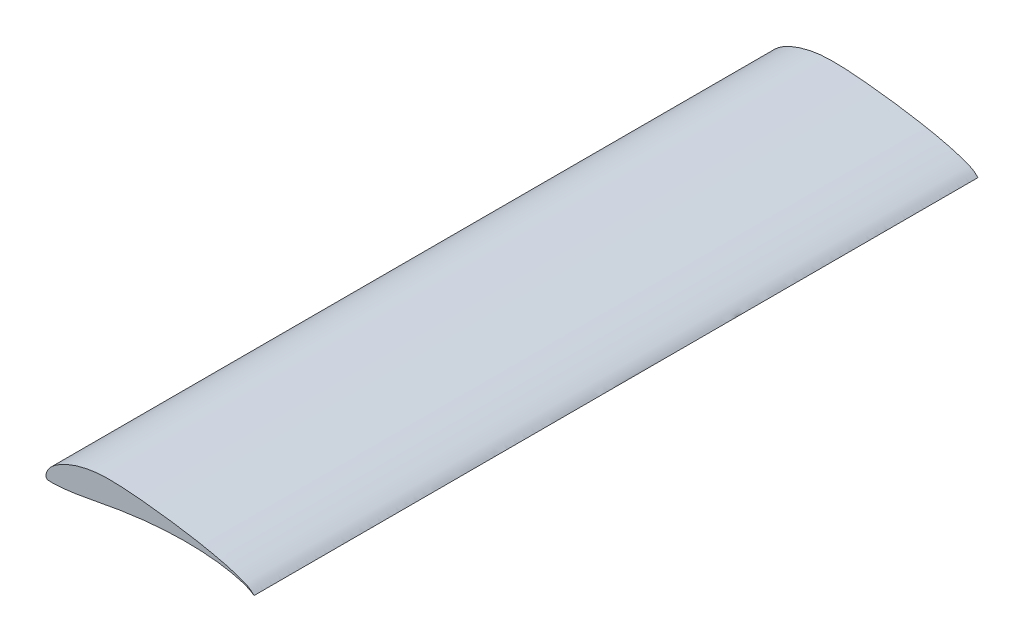
ISO-10303-21;
HEADER;
FILE_DESCRIPTION(('STEP AP214'),'2;1');
FILE_NAME('part.step','',(''),(''),'','','');
FILE_SCHEMA(('AUTOMOTIVE_DESIGN { 1 0 10303 214 1 1 1 1 }'));
ENDSEC;
DATA;
#1=APPLICATION_CONTEXT('core data for automotive mechanical design processes');
#2=APPLICATION_PROTOCOL_DEFINITION('international standard','automotive_design',2000,#1);
#3=PRODUCT_CONTEXT('',#1,'mechanical');
#4=PRODUCT('Part','Part','',(#3));
#5=PRODUCT_RELATED_PRODUCT_CATEGORY('part','',(#4));
#6=PRODUCT_DEFINITION_FORMATION('','',#4);
#7=PRODUCT_DEFINITION_CONTEXT('part definition',#1,'design');
#8=PRODUCT_DEFINITION('design','',#6,#7);
#9=PRODUCT_DEFINITION_SHAPE('','',#8);
#10=(LENGTH_UNIT() NAMED_UNIT(*) SI_UNIT(.MILLI.,.METRE.));
#11=(NAMED_UNIT(*) PLANE_ANGLE_UNIT() SI_UNIT($,.RADIAN.));
#12=(NAMED_UNIT(*) SI_UNIT($,.STERADIAN.) SOLID_ANGLE_UNIT());
#13=UNCERTAINTY_MEASURE_WITH_UNIT(LENGTH_MEASURE(1.E-05),#10,'distance_accuracy_value','');
#14=(GEOMETRIC_REPRESENTATION_CONTEXT(3) GLOBAL_UNCERTAINTY_ASSIGNED_CONTEXT((#13)) GLOBAL_UNIT_ASSIGNED_CONTEXT((#10,
#11,#12)) REPRESENTATION_CONTEXT('',''));
#15=CARTESIAN_POINT('',(0.,0.,0.));
#16=DIRECTION('',(0.,0.,1.));
#17=DIRECTION('',(1.,0.,0.));
#18=AXIS2_PLACEMENT_3D('',#15,#16,#17);
#19=CARTESIAN_POINT('',(292.1,0.,-508.));
#20=CARTESIAN_POINT('',(292.10174868937,0.00743604675368815,-508.));
#21=CARTESIAN_POINT('',(291.141508660816,0.722880275148406,-508.));
#22=CARTESIAN_POINT('',(290.329412119825,1.51968766740587,-508.));
#23=CARTESIAN_POINT('',(288.526229752874,3.1839768216267,-508.));
#24=CARTESIAN_POINT('',(286.398896153237,4.95446224072514,-508.));
#25=CARTESIAN_POINT('',(283.488886511464,6.73930853472732,-508.));
#26=CARTESIAN_POINT('',(279.870267403727,8.46902637101378,-508.));
#27=CARTESIAN_POINT('',(275.501742517788,10.2741964429917,-508.));
#28=CARTESIAN_POINT('',(270.389970767966,12.1296834292676,-508.));
#29=CARTESIAN_POINT('',(264.558800095709,14.0223796918718,-508.));
#30=CARTESIAN_POINT('',(258.038502142609,15.9358521159861,-508.));
#31=CARTESIAN_POINT('',(250.865588759589,17.8611197811556,-508.));
#32=CARTESIAN_POINT('',(243.079665674688,19.7805050529815,-508.));
#33=CARTESIAN_POINT('',(234.725371616939,21.6801135934577,-508.));
#34=CARTESIAN_POINT('',(225.852500238387,23.5480804603595,-508.));
#35=CARTESIAN_POINT('',(216.515233407206,25.3748028765026,-508.));
#36=CARTESIAN_POINT('',(206.768143255614,27.1378019443082,-508.));
#37=CARTESIAN_POINT('',(196.672609042899,28.8345588430789,-508.));
#38=CARTESIAN_POINT('',(186.286812137133,30.4432245657055,-508.));
#39=CARTESIAN_POINT('',(175.677917755839,31.9669403467707,-508.));
#40=CARTESIAN_POINT('',(164.913916248448,33.3936314987688,-508.));
#41=CARTESIAN_POINT('',(154.072771327712,34.7187326881358,-508.));
#42=CARTESIAN_POINT('',(143.241149724161,35.951626349718,-508.));
#43=CARTESIAN_POINT('',(132.508721132156,37.0612033919483,-508.));
#44=CARTESIAN_POINT('',(121.962921004099,38.0266968191774,-508.));
#45=CARTESIAN_POINT('',(111.677919879016,38.7937633881828,-508.));
#46=CARTESIAN_POINT('',(101.712469459807,39.3214067384732,-508.));
#47=CARTESIAN_POINT('',(92.1220108045362,39.5492677217701,-508.));
#48=CARTESIAN_POINT('',(82.9556744692644,39.5250134087812,-508.));
#49=CARTESIAN_POINT('',(74.230559217162,39.0762027810472,-508.));
#50=CARTESIAN_POINT('',(65.9432851771043,38.1667082620123,-508.));
#51=CARTESIAN_POINT('',(58.0601167104942,36.8806695246744,-508.));
#52=CARTESIAN_POINT('',(50.5791512076867,35.2146176935372,-508.));
#53=CARTESIAN_POINT('',(43.5080742697038,33.2609395194381,-508.));
#54=CARTESIAN_POINT('',(36.8768044967487,31.0542376340717,-508.));
#55=CARTESIAN_POINT('',(30.7135440676395,28.6461158404434,-508.));
#56=CARTESIAN_POINT('',(25.0565922045393,26.0494759704529,-508.));
#57=CARTESIAN_POINT('',(19.9240904833014,23.3170372834694,-508.));
#58=CARTESIAN_POINT('',(15.3439613996676,20.4798728856683,-508.));
#59=CARTESIAN_POINT('',(11.3449274165843,17.5764288153793,-508.));
#60=CARTESIAN_POINT('',(7.9286385316132,14.6682470834465,-508.));
#61=CARTESIAN_POINT('',(5.14463693597222,11.7235827007778,-508.));
#62=CARTESIAN_POINT('',(3.00616860546707,8.7679365241755,-508.));
#63=CARTESIAN_POINT('',(1.42653590916057,5.89248641393546,-508.));
#64=CARTESIAN_POINT('',(0.414158520577073,3.16238276856456,-508.));
#65=CARTESIAN_POINT('',(-0.0682393541580431,0.642497929707103,-508.));
#66=CARTESIAN_POINT('',(0.0248764908269175,-1.48872736429846,-508.));
#67=CARTESIAN_POINT('',(0.573568752551456,-3.44340437544131,-508.));
#68=CARTESIAN_POINT('',(2.6131457490381,-4.41372036340078,-508.));
#69=CARTESIAN_POINT('',(5.35538380182884,-4.54985264061287,-508.));
#70=CARTESIAN_POINT('',(9.10675523423053,-4.68179257905758,-508.));
#71=CARTESIAN_POINT('',(13.8243695657241,-4.4783591430176,-508.));
#72=CARTESIAN_POINT('',(19.454908435426,-4.10451048328887,-508.));
#73=CARTESIAN_POINT('',(25.9357098231297,-3.50568599781193,-508.));
#74=CARTESIAN_POINT('',(33.2004571710568,-2.6954507219614,-508.));
#75=CARTESIAN_POINT('',(41.2137256622462,-1.65641846833688,-508.));
#76=CARTESIAN_POINT('',(49.9715993306038,-0.204216290787929,-508.));
#77=CARTESIAN_POINT('',(59.5167195116737,1.61682170012857,-508.));
#78=CARTESIAN_POINT('',(69.896805381292,3.59869214324346,-508.));
#79=CARTESIAN_POINT('',(81.0611199266692,5.69126319732166,-508.));
#80=CARTESIAN_POINT('',(92.9395395106316,7.8076789174098,-508.));
#81=CARTESIAN_POINT('',(105.444828594614,9.86851270360842,-508.));
#82=CARTESIAN_POINT('',(118.479970276983,11.804947922966,-508.));
#83=CARTESIAN_POINT('',(131.932628307681,13.5459491662827,-508.));
#84=CARTESIAN_POINT('',(145.681826700154,15.0408226784285,-508.));
#85=CARTESIAN_POINT('',(159.597686458834,16.2224586379187,-508.));
#86=CARTESIAN_POINT('',(173.540558501566,17.0600928311949,-508.));
#87=CARTESIAN_POINT('',(187.364775606378,17.5205867438787,-508.));
#88=CARTESIAN_POINT('',(200.92036927669,17.5787504245125,-508.));
#89=CARTESIAN_POINT('',(214.056105634627,17.2306319225389,-508.));
#90=CARTESIAN_POINT('',(226.621572717158,16.4843807599247,-508.));
#91=CARTESIAN_POINT('',(238.465672561794,15.3496255862295,-508.));
#92=CARTESIAN_POINT('',(249.447394068302,13.8699238511772,-508.));
#93=CARTESIAN_POINT('',(259.423758739276,12.0882109216768,-508.));
#94=CARTESIAN_POINT('',(268.277798116503,10.0641585717298,-508.));
#95=CARTESIAN_POINT('',(275.846336321307,7.8983323858687,-508.));
#96=CARTESIAN_POINT('',(282.040404303042,5.58677570384364,-508.));
#97=CARTESIAN_POINT('',(286.45971236369,3.47140540189966,-508.));
#98=CARTESIAN_POINT('',(289.717950220251,1.51546296693716,-508.));
#99=CARTESIAN_POINT('',(290.969625095689,0.758545510651311,-508.));
#100=CARTESIAN_POINT('',(292.098215759933,-0.00758722091191827,-508.));
#101=CARTESIAN_POINT('',(292.1,0.,-508.));
#102=B_SPLINE_CURVE_WITH_KNOTS('',3,(#19,#20,#21,#22,#23,#24,#25,#26,#27,#28,#29,#30,#31,#32,
#33,#34,#35,#36,#37,#38,#39,#40,#41,#42,#43,#44,#45,#46,#47,#48,#49,#50,#51,#52,#53,#54,#55,#56,
#57,#58,#59,#60,#61,#62,#63,#64,#65,#66,#67,#68,#69,#70,#71,#72,#73,#74,#75,#76,#77,#78,#79,#80,
#81,#82,#83,#84,#85,#86,#87,#88,#89,#90,#91,#92,#93,#94,#95,#96,#97,#98,#99,#100,#101),
.UNSPECIFIED.,.T.,.F.,(4,1,1,1,1,1,1,1,1,1,1,1,1,1,1,1,1,1,1,1,1,1,1,1,1,1,1,1,1,1,1,1,1,1,1,1,
1,1,1,1,1,1,1,1,1,1,1,1,1,1,1,1,1,1,1,1,1,1,1,1,1,1,1,1,1,1,1,1,1,1,1,1,1,1,1,1,1,1,1,1,4),(0.,
0.000979677557134093,0.00364886216776309,0.00748349851947811,0.0120952771855934,
0.0175255907768788,0.024051779993871,0.0317830505527586,0.0406778280832618,0.0507103007904779,
0.0618332290621795,0.0739892504845853,0.0871181731906812,0.101145048769791,0.115990637111827,
0.131570421640589,0.147788379302961,0.164550916882416,0.181757895150531,0.199311954944345,
0.217095071712264,0.234990228463986,0.252856883122009,0.270540593729572,0.287886779266045,
0.304773437599674,0.321101419214061,0.336806063174811,0.351800032584037,0.366031063392082,
0.379615674919835,0.392652962879186,0.405170358707495,0.417171919049936,0.428603516911185,
0.43941895910826,0.449596586064162,0.459102079103161,0.467907877534646,0.475988300736527,
0.483308968746149,0.489874507816402,0.495803249719207,0.501149411695553,0.50590307325604,
0.510046768536663,0.513579310681042,0.516446926626751,0.5193500525909,0.523823355179486,
0.529973793997694,0.537715654387927,0.546967844488146,0.55763736682571,0.569620481096633,
0.582804124215616,0.597246960791633,0.613135036654701,0.630443600329816,0.649056123608546,
0.668822256795696,0.689594964002684,0.711189650864602,0.733426688964389,0.756094117504156,
0.778988553684861,0.801889682684955,0.824566597829707,0.846792284880412,0.868338290507787,
0.888978162959066,0.908492011340558,0.926658767581933,0.943286193042322,0.958169210358794,
0.971135821634751,0.981955623079976,0.990251791025976,0.995852565249962,0.999000405686701,1.),.UNSPECIFIED.);
#103=DIRECTION('',(0.,0.,1.));
#104=VECTOR('',#103,1.);
#105=SURFACE_OF_LINEAR_EXTRUSION('',#102,#104);
#106=CARTESIAN_POINT('',(292.1,0.,-508.));
#107=VERTEX_POINT('',#106);
#108=EDGE_CURVE('E10',#107,#107,#102,.T.);
#109=ORIENTED_EDGE('',*,*,#108,.T.);
#110=EDGE_LOOP('',(#109));
#111=FACE_BOUND('',#110,.T.);
#112=CARTESIAN_POINT('',(292.1,0.,508.));
#113=CARTESIAN_POINT('',(292.10174868937,0.00743604675368815,508.));
#114=CARTESIAN_POINT('',(291.141508660816,0.722880275148406,508.));
#115=CARTESIAN_POINT('',(290.329412119825,1.51968766740587,508.));
#116=CARTESIAN_POINT('',(288.526229752874,3.1839768216267,508.));
#117=CARTESIAN_POINT('',(286.398896153237,4.95446224072514,508.));
#118=CARTESIAN_POINT('',(283.488886511464,6.73930853472732,508.));
#119=CARTESIAN_POINT('',(279.870267403727,8.46902637101378,508.));
#120=CARTESIAN_POINT('',(275.501742517788,10.2741964429917,508.));
#121=CARTESIAN_POINT('',(270.389970767966,12.1296834292676,508.));
#122=CARTESIAN_POINT('',(264.558800095709,14.0223796918718,508.));
#123=CARTESIAN_POINT('',(258.038502142609,15.9358521159861,508.));
#124=CARTESIAN_POINT('',(250.865588759589,17.8611197811556,508.));
#125=CARTESIAN_POINT('',(243.079665674688,19.7805050529815,508.));
#126=CARTESIAN_POINT('',(234.725371616939,21.6801135934577,508.));
#127=CARTESIAN_POINT('',(225.852500238387,23.5480804603595,508.));
#128=CARTESIAN_POINT('',(216.515233407206,25.3748028765026,508.));
#129=CARTESIAN_POINT('',(206.768143255614,27.1378019443082,508.));
#130=CARTESIAN_POINT('',(196.672609042899,28.8345588430789,508.));
#131=CARTESIAN_POINT('',(186.286812137133,30.4432245657055,508.));
#132=CARTESIAN_POINT('',(175.677917755839,31.9669403467707,508.));
#133=CARTESIAN_POINT('',(164.913916248448,33.3936314987688,508.));
#134=CARTESIAN_POINT('',(154.072771327712,34.7187326881358,508.));
#135=CARTESIAN_POINT('',(143.241149724161,35.951626349718,508.));
#136=CARTESIAN_POINT('',(132.508721132156,37.0612033919483,508.));
#137=CARTESIAN_POINT('',(121.962921004099,38.0266968191774,508.));
#138=CARTESIAN_POINT('',(111.677919879016,38.7937633881828,508.));
#139=CARTESIAN_POINT('',(101.712469459807,39.3214067384732,508.));
#140=CARTESIAN_POINT('',(92.1220108045362,39.5492677217701,508.));
#141=CARTESIAN_POINT('',(82.9556744692644,39.5250134087812,508.));
#142=CARTESIAN_POINT('',(74.230559217162,39.0762027810472,508.));
#143=CARTESIAN_POINT('',(65.9432851771043,38.1667082620123,508.));
#144=CARTESIAN_POINT('',(58.0601167104942,36.8806695246744,508.));
#145=CARTESIAN_POINT('',(50.5791512076867,35.2146176935372,508.));
#146=CARTESIAN_POINT('',(43.5080742697038,33.2609395194381,508.));
#147=CARTESIAN_POINT('',(36.8768044967487,31.0542376340717,508.));
#148=CARTESIAN_POINT('',(30.7135440676395,28.6461158404434,508.));
#149=CARTESIAN_POINT('',(25.0565922045393,26.0494759704529,508.));
#150=CARTESIAN_POINT('',(19.9240904833014,23.3170372834694,508.));
#151=CARTESIAN_POINT('',(15.3439613996676,20.4798728856683,508.));
#152=CARTESIAN_POINT('',(11.3449274165843,17.5764288153793,508.));
#153=CARTESIAN_POINT('',(7.9286385316132,14.6682470834465,508.));
#154=CARTESIAN_POINT('',(5.14463693597222,11.7235827007778,508.));
#155=CARTESIAN_POINT('',(3.00616860546707,8.7679365241755,508.));
#156=CARTESIAN_POINT('',(1.42653590916057,5.89248641393546,508.));
#157=CARTESIAN_POINT('',(0.414158520577073,3.16238276856456,508.));
#158=CARTESIAN_POINT('',(-0.0682393541580431,0.642497929707103,508.));
#159=CARTESIAN_POINT('',(0.0248764908269175,-1.48872736429846,508.));
#160=CARTESIAN_POINT('',(0.573568752551456,-3.44340437544131,508.));
#161=CARTESIAN_POINT('',(2.6131457490381,-4.41372036340078,508.));
#162=CARTESIAN_POINT('',(5.35538380182884,-4.54985264061287,508.));
#163=CARTESIAN_POINT('',(9.10675523423053,-4.68179257905758,508.));
#164=CARTESIAN_POINT('',(13.8243695657241,-4.4783591430176,508.));
#165=CARTESIAN_POINT('',(19.454908435426,-4.10451048328887,508.));
#166=CARTESIAN_POINT('',(25.9357098231297,-3.50568599781193,508.));
#167=CARTESIAN_POINT('',(33.2004571710568,-2.6954507219614,508.));
#168=CARTESIAN_POINT('',(41.2137256622462,-1.65641846833688,508.));
#169=CARTESIAN_POINT('',(49.9715993306038,-0.204216290787929,508.));
#170=CARTESIAN_POINT('',(59.5167195116737,1.61682170012857,508.));
#171=CARTESIAN_POINT('',(69.896805381292,3.59869214324346,508.));
#172=CARTESIAN_POINT('',(81.0611199266692,5.69126319732166,508.));
#173=CARTESIAN_POINT('',(92.9395395106316,7.8076789174098,508.));
#174=CARTESIAN_POINT('',(105.444828594614,9.86851270360842,508.));
#175=CARTESIAN_POINT('',(118.479970276983,11.804947922966,508.));
#176=CARTESIAN_POINT('',(131.932628307681,13.5459491662827,508.));
#177=CARTESIAN_POINT('',(145.681826700154,15.0408226784285,508.));
#178=CARTESIAN_POINT('',(159.597686458834,16.2224586379187,508.));
#179=CARTESIAN_POINT('',(173.540558501566,17.0600928311949,508.));
#180=CARTESIAN_POINT('',(187.364775606378,17.5205867438787,508.));
#181=CARTESIAN_POINT('',(200.92036927669,17.5787504245125,508.));
#182=CARTESIAN_POINT('',(214.056105634627,17.2306319225389,508.));
#183=CARTESIAN_POINT('',(226.621572717158,16.4843807599247,508.));
#184=CARTESIAN_POINT('',(238.465672561794,15.3496255862295,508.));
#185=CARTESIAN_POINT('',(249.447394068302,13.8699238511772,508.));
#186=CARTESIAN_POINT('',(259.423758739276,12.0882109216768,508.));
#187=CARTESIAN_POINT('',(268.277798116503,10.0641585717298,508.));
#188=CARTESIAN_POINT('',(275.846336321307,7.8983323858687,508.));
#189=CARTESIAN_POINT('',(282.040404303042,5.58677570384364,508.));
#190=CARTESIAN_POINT('',(286.45971236369,3.47140540189966,508.));
#191=CARTESIAN_POINT('',(289.717950220251,1.51546296693716,508.));
#192=CARTESIAN_POINT('',(290.969625095689,0.758545510651311,508.));
#193=CARTESIAN_POINT('',(292.098215759933,-0.00758722091191827,508.));
#194=CARTESIAN_POINT('',(292.1,0.,508.));
#195=B_SPLINE_CURVE_WITH_KNOTS('',3,(#112,#113,#114,#115,#116,#117,#118,#119,#120,#121,#122,
#123,#124,#125,#126,#127,#128,#129,#130,#131,#132,#133,#134,#135,#136,#137,#138,#139,#140,#141,
#142,#143,#144,#145,#146,#147,#148,#149,#150,#151,#152,#153,#154,#155,#156,#157,#158,#159,#160,
#161,#162,#163,#164,#165,#166,#167,#168,#169,#170,#171,#172,#173,#174,#175,#176,#177,#178,#179,
#180,#181,#182,#183,#184,#185,#186,#187,#188,#189,#190,#191,#192,#193,#194),.UNSPECIFIED.,.T.,
.F.,(4,1,1,1,1,1,1,1,1,1,1,1,1,1,1,1,1,1,1,1,1,1,1,1,1,1,1,1,1,1,1,1,1,1,1,1,1,1,1,1,1,1,1,1,1,
1,1,1,1,1,1,1,1,1,1,1,1,1,1,1,1,1,1,1,1,1,1,1,1,1,1,1,1,1,1,1,1,1,1,1,4),(0.,
0.000979677557134093,0.00364886216776309,0.00748349851947811,0.0120952771855934,
0.0175255907768788,0.024051779993871,0.0317830505527586,0.0406778280832618,0.0507103007904779,
0.0618332290621795,0.0739892504845853,0.0871181731906812,0.101145048769791,0.115990637111827,
0.131570421640589,0.147788379302961,0.164550916882416,0.181757895150531,0.199311954944345,
0.217095071712264,0.234990228463986,0.252856883122009,0.270540593729572,0.287886779266045,
0.304773437599674,0.321101419214061,0.336806063174811,0.351800032584037,0.366031063392082,
0.379615674919835,0.392652962879186,0.405170358707495,0.417171919049936,0.428603516911185,
0.43941895910826,0.449596586064162,0.459102079103161,0.467907877534646,0.475988300736527,
0.483308968746149,0.489874507816402,0.495803249719207,0.501149411695553,0.50590307325604,
0.510046768536663,0.513579310681042,0.516446926626751,0.5193500525909,0.523823355179486,
0.529973793997694,0.537715654387927,0.546967844488146,0.55763736682571,0.569620481096633,
0.582804124215616,0.597246960791633,0.613135036654701,0.630443600329816,0.649056123608546,
0.668822256795696,0.689594964002684,0.711189650864602,0.733426688964389,0.756094117504156,
0.778988553684861,0.801889682684955,0.824566597829707,0.846792284880412,0.868338290507787,
0.888978162959066,0.908492011340558,0.926658767581933,0.943286193042322,0.958169210358794,
0.971135821634751,0.981955623079976,0.990251791025976,0.995852565249962,0.999000405686701,1.),.UNSPECIFIED.);
#196=CARTESIAN_POINT('',(292.1,0.,508.));
#197=VERTEX_POINT('',#196);
#198=EDGE_CURVE('E51',#197,#197,#195,.T.);
#199=ORIENTED_EDGE('',*,*,#198,.F.);
#200=EDGE_LOOP('',(#199));
#201=FACE_BOUND('',#200,.T.);
#202=ADVANCED_FACE('F41',(#111,#201),#105,.T.);
#203=CARTESIAN_POINT('',(1.74611986948222,6.38763831285736,-508.));
#204=DIRECTION('',(0.,0.,-1.));
#205=DIRECTION('',(-1.,0.,0.));
#206=AXIS2_PLACEMENT_3D('',#203,#204,#205);
#207=PLANE('',#206);
#208=ORIENTED_EDGE('',*,*,#108,.F.);
#209=EDGE_LOOP('',(#208));
#210=FACE_BOUND('',#209,.T.);
#211=ADVANCED_FACE('F68',(#210),#207,.T.);
#212=CARTESIAN_POINT('',(1.74611986948222,6.38763831285736,508.));
#213=DIRECTION('',(0.,0.,-1.));
#214=DIRECTION('',(-1.,0.,0.));
#215=AXIS2_PLACEMENT_3D('',#212,#213,#214);
#216=PLANE('',#215);
#217=ORIENTED_EDGE('',*,*,#198,.T.);
#218=EDGE_LOOP('',(#217));
#219=FACE_BOUND('',#218,.T.);
#220=ADVANCED_FACE('F65',(#219),#216,.F.);
#221=CLOSED_SHELL('',(#202,#211,#220));
#222=MANIFOLD_SOLID_BREP('B2',#221);
#223=ADVANCED_BREP_SHAPE_REPRESENTATION('',(#18,#222),#14);
#224=SHAPE_DEFINITION_REPRESENTATION(#9,#223);
ENDSEC;
END-ISO-10303-21;
